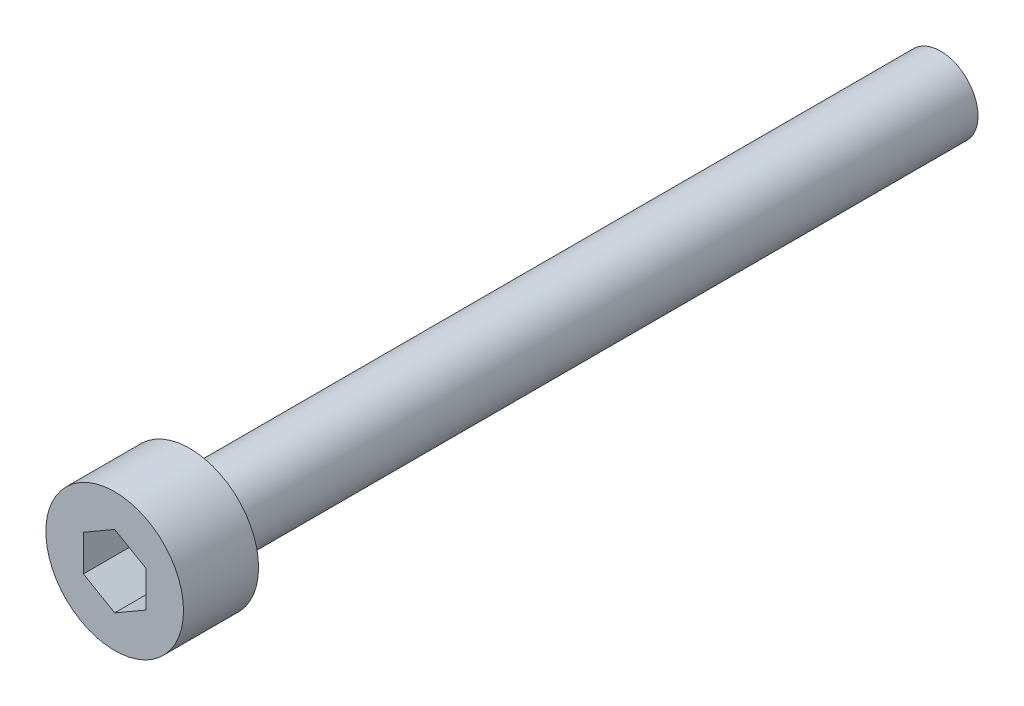
ISO-10303-21;
HEADER;
FILE_DESCRIPTION(('STEP AP214'),'2;1');
FILE_NAME('part.step','',(''),(''),'','','');
FILE_SCHEMA(('AUTOMOTIVE_DESIGN { 1 0 10303 214 1 1 1 1 }'));
ENDSEC;
DATA;
#1=APPLICATION_CONTEXT('core data for automotive mechanical design processes');
#2=APPLICATION_PROTOCOL_DEFINITION('international standard','automotive_design',2000,#1);
#3=PRODUCT_CONTEXT('',#1,'mechanical');
#4=PRODUCT('Part','Part','',(#3));
#5=PRODUCT_RELATED_PRODUCT_CATEGORY('part','',(#4));
#6=PRODUCT_DEFINITION_FORMATION('','',#4);
#7=PRODUCT_DEFINITION_CONTEXT('part definition',#1,'design');
#8=PRODUCT_DEFINITION('design','',#6,#7);
#9=PRODUCT_DEFINITION_SHAPE('','',#8);
#10=(LENGTH_UNIT() NAMED_UNIT(*) SI_UNIT(.MILLI.,.METRE.));
#11=(NAMED_UNIT(*) PLANE_ANGLE_UNIT() SI_UNIT($,.RADIAN.));
#12=(NAMED_UNIT(*) SI_UNIT($,.STERADIAN.) SOLID_ANGLE_UNIT());
#13=UNCERTAINTY_MEASURE_WITH_UNIT(LENGTH_MEASURE(1.E-05),#10,'distance_accuracy_value','');
#14=(GEOMETRIC_REPRESENTATION_CONTEXT(3) GLOBAL_UNCERTAINTY_ASSIGNED_CONTEXT((#13)) GLOBAL_UNIT_ASSIGNED_CONTEXT((#10,
#11,#12)) REPRESENTATION_CONTEXT('',''));
#15=CARTESIAN_POINT('',(0.,0.,0.));
#16=DIRECTION('',(0.,0.,1.));
#17=DIRECTION('',(1.,0.,0.));
#18=AXIS2_PLACEMENT_3D('',#15,#16,#17);
#19=CARTESIAN_POINT('',(0.,0.,0.));
#20=DIRECTION('',(0.,0.,-1.));
#21=DIRECTION('',(-1.,0.,0.));
#22=AXIS2_PLACEMENT_3D('',#19,#20,#21);
#23=CYLINDRICAL_SURFACE('',#22,1.5);
#24=CARTESIAN_POINT('',(0.,0.,0.));
#25=DIRECTION('',(0.,0.,1.));
#26=DIRECTION('',(1.,0.,0.));
#27=AXIS2_PLACEMENT_3D('',#24,#25,#26);
#28=CIRCLE('',#27,1.5);
#29=CARTESIAN_POINT('',(1.5,0.,0.));
#30=VERTEX_POINT('',#29);
#31=EDGE_CURVE('E11',#30,#30,#28,.T.);
#32=ORIENTED_EDGE('',*,*,#31,.F.);
#33=EDGE_LOOP('',(#32));
#34=FACE_BOUND('',#33,.T.);
#35=CARTESIAN_POINT('',(0.,0.,-30.));
#36=DIRECTION('',(0.,0.,1.));
#37=DIRECTION('',(1.,0.,0.));
#38=AXIS2_PLACEMENT_3D('',#35,#36,#37);
#39=CIRCLE('',#38,1.5);
#40=CARTESIAN_POINT('',(1.5,0.,-30.));
#41=VERTEX_POINT('',#40);
#42=EDGE_CURVE('E46',#41,#41,#39,.T.);
#43=ORIENTED_EDGE('',*,*,#42,.T.);
#44=EDGE_LOOP('',(#43));
#45=FACE_BOUND('',#44,.T.);
#46=ADVANCED_FACE('F43',(#34,#45),#23,.T.);
#47=CARTESIAN_POINT('',(0.,0.,-30.));
#48=DIRECTION('',(0.,0.,1.));
#49=DIRECTION('',(1.,0.,0.));
#50=AXIS2_PLACEMENT_3D('',#47,#48,#49);
#51=PLANE('',#50);
#52=ORIENTED_EDGE('',*,*,#42,.F.);
#53=EDGE_LOOP('',(#52));
#54=FACE_BOUND('',#53,.T.);
#55=ADVANCED_FACE('F164',(#54),#51,.F.);
#56=CARTESIAN_POINT('',(0.,0.,3.));
#57=DIRECTION('',(0.,0.,1.));
#58=DIRECTION('',(1.,0.,0.));
#59=AXIS2_PLACEMENT_3D('',#56,#57,#58);
#60=PLANE('',#59);
#61=CARTESIAN_POINT('',(0.,0.,3.));
#62=DIRECTION('',(0.,0.,1.));
#63=DIRECTION('',(1.,0.,0.));
#64=AXIS2_PLACEMENT_3D('',#61,#62,#63);
#65=CIRCLE('',#64,2.75);
#66=CARTESIAN_POINT('',(2.75,0.,3.));
#67=VERTEX_POINT('',#66);
#68=EDGE_CURVE('E146',#67,#67,#65,.T.);
#69=ORIENTED_EDGE('',*,*,#68,.T.);
#70=EDGE_LOOP('',(#69));
#71=FACE_BOUND('',#70,.T.);
#72=DIRECTION('',(-0.866025403784439,0.5,0.));
#73=VECTOR('',#72,1.);
#74=CARTESIAN_POINT('',(1.25,0.721687836487032,3.));
#75=LINE('',#74,#73);
#76=CARTESIAN_POINT('',(1.25,0.721687836487032,3.));
#77=VERTEX_POINT('',#76);
#78=CARTESIAN_POINT('',(0.,1.44337567297406,3.));
#79=VERTEX_POINT('',#78);
#80=EDGE_CURVE('E103',#77,#79,#75,.T.);
#81=ORIENTED_EDGE('',*,*,#80,.F.);
#82=DIRECTION('',(0.,1.,0.));
#83=VECTOR('',#82,1.);
#84=CARTESIAN_POINT('',(1.25,-0.721687836487033,3.));
#85=LINE('',#84,#83);
#86=CARTESIAN_POINT('',(1.25,-0.721687836487033,3.));
#87=VERTEX_POINT('',#86);
#88=EDGE_CURVE('E94',#87,#77,#85,.T.);
#89=ORIENTED_EDGE('',*,*,#88,.F.);
#90=DIRECTION('',(0.866025403784439,0.5,0.));
#91=VECTOR('',#90,1.);
#92=CARTESIAN_POINT('',(0.,-1.44337567297406,3.));
#93=LINE('',#92,#91);
#94=CARTESIAN_POINT('',(0.,-1.44337567297406,3.));
#95=VERTEX_POINT('',#94);
#96=EDGE_CURVE('E124',#95,#87,#93,.T.);
#97=ORIENTED_EDGE('',*,*,#96,.F.);
#98=DIRECTION('',(0.866025403784439,-0.5,0.));
#99=VECTOR('',#98,1.);
#100=CARTESIAN_POINT('',(-1.25,-0.721687836487032,3.));
#101=LINE('',#100,#99);
#102=CARTESIAN_POINT('',(-1.25,-0.721687836487032,3.));
#103=VERTEX_POINT('',#102);
#104=EDGE_CURVE('E121',#103,#95,#101,.T.);
#105=ORIENTED_EDGE('',*,*,#104,.F.);
#106=DIRECTION('',(0.,-1.,0.));
#107=VECTOR('',#106,1.);
#108=CARTESIAN_POINT('',(-1.25,0.721687836487032,3.));
#109=LINE('',#108,#107);
#110=CARTESIAN_POINT('',(-1.25,0.721687836487032,3.));
#111=VERTEX_POINT('',#110);
#112=EDGE_CURVE('E117',#111,#103,#109,.T.);
#113=ORIENTED_EDGE('',*,*,#112,.F.);
#114=DIRECTION('',(-0.866025403784439,-0.5,0.));
#115=VECTOR('',#114,1.);
#116=CARTESIAN_POINT('',(0.,1.44337567297406,3.));
#117=LINE('',#116,#115);
#118=EDGE_CURVE('E115',#79,#111,#117,.T.);
#119=ORIENTED_EDGE('',*,*,#118,.F.);
#120=EDGE_LOOP('',(#81,#89,#97,#105,#113,#119));
#121=FACE_BOUND('',#120,.T.);
#122=ADVANCED_FACE('F113',(#71,#121),#60,.T.);
#123=CARTESIAN_POINT('',(0.,0.,0.));
#124=DIRECTION('',(0.,0.,1.));
#125=DIRECTION('',(1.,0.,0.));
#126=AXIS2_PLACEMENT_3D('',#123,#124,#125);
#127=PLANE('',#126);
#128=ORIENTED_EDGE('',*,*,#31,.T.);
#129=EDGE_LOOP('',(#128));
#130=FACE_BOUND('',#129,.T.);
#131=CARTESIAN_POINT('',(0.,0.,0.));
#132=DIRECTION('',(0.,0.,1.));
#133=DIRECTION('',(1.,0.,0.));
#134=AXIS2_PLACEMENT_3D('',#131,#132,#133);
#135=CIRCLE('',#134,2.75);
#136=CARTESIAN_POINT('',(2.75,0.,0.));
#137=VERTEX_POINT('',#136);
#138=EDGE_CURVE('E109',#137,#137,#135,.T.);
#139=ORIENTED_EDGE('',*,*,#138,.F.);
#140=EDGE_LOOP('',(#139));
#141=FACE_BOUND('',#140,.T.);
#142=ADVANCED_FACE('F154',(#130,#141),#127,.F.);
#143=CARTESIAN_POINT('',(0.,0.,3.));
#144=DIRECTION('',(0.,0.,-1.));
#145=DIRECTION('',(-1.,0.,0.));
#146=AXIS2_PLACEMENT_3D('',#143,#144,#145);
#147=CYLINDRICAL_SURFACE('',#146,2.75);
#148=ORIENTED_EDGE('',*,*,#68,.F.);
#149=EDGE_LOOP('',(#148));
#150=FACE_BOUND('',#149,.T.);
#151=ORIENTED_EDGE('',*,*,#138,.T.);
#152=EDGE_LOOP('',(#151));
#153=FACE_BOUND('',#152,.T.);
#154=ADVANCED_FACE('F152',(#150,#153),#147,.T.);
#155=CARTESIAN_POINT('',(1.25,-0.721687836487033,3.));
#156=DIRECTION('',(-1.,0.,0.));
#157=DIRECTION('',(0.,-1.,0.));
#158=AXIS2_PLACEMENT_3D('',#155,#156,#157);
#159=PLANE('',#158);
#160=DIRECTION('',(0.,1.,0.));
#161=VECTOR('',#160,1.);
#162=CARTESIAN_POINT('',(1.25,-0.721687836487033,0.));
#163=LINE('',#162,#161);
#164=CARTESIAN_POINT('',(1.25,-0.721687836487033,0.));
#165=VERTEX_POINT('',#164);
#166=CARTESIAN_POINT('',(1.25,0.721687836487032,0.));
#167=VERTEX_POINT('',#166);
#168=EDGE_CURVE('E57',#165,#167,#163,.T.);
#169=ORIENTED_EDGE('',*,*,#168,.F.);
#170=DIRECTION('',(0.,0.,-1.));
#171=VECTOR('',#170,1.);
#172=CARTESIAN_POINT('',(1.25,-0.721687836487033,3.));
#173=LINE('',#172,#171);
#174=EDGE_CURVE('E99',#87,#165,#173,.T.);
#175=ORIENTED_EDGE('',*,*,#174,.F.);
#176=ORIENTED_EDGE('',*,*,#88,.T.);
#177=DIRECTION('',(0.,0.,-1.));
#178=VECTOR('',#177,1.);
#179=CARTESIAN_POINT('',(1.25,0.721687836487032,3.));
#180=LINE('',#179,#178);
#181=EDGE_CURVE('E97',#77,#167,#180,.T.);
#182=ORIENTED_EDGE('',*,*,#181,.T.);
#183=EDGE_LOOP('',(#169,#175,#176,#182));
#184=FACE_BOUND('',#183,.T.);
#185=ADVANCED_FACE('F96',(#184),#159,.T.);
#186=CARTESIAN_POINT('',(1.25,0.721687836487032,3.));
#187=DIRECTION('',(-0.5,-0.866025403784439,0.));
#188=DIRECTION('',(0.866025403784439,-0.5,0.));
#189=AXIS2_PLACEMENT_3D('',#186,#187,#188);
#190=PLANE('',#189);
#191=DIRECTION('',(-0.866025403784439,0.5,0.));
#192=VECTOR('',#191,1.);
#193=CARTESIAN_POINT('',(1.25,0.721687836487032,0.));
#194=LINE('',#193,#192);
#195=CARTESIAN_POINT('',(0.,1.44337567297406,0.));
#196=VERTEX_POINT('',#195);
#197=EDGE_CURVE('E61',#167,#196,#194,.T.);
#198=ORIENTED_EDGE('',*,*,#197,.F.);
#199=ORIENTED_EDGE('',*,*,#181,.F.);
#200=ORIENTED_EDGE('',*,*,#80,.T.);
#201=DIRECTION('',(0.,0.,-1.));
#202=VECTOR('',#201,1.);
#203=CARTESIAN_POINT('',(0.,1.44337567297406,3.));
#204=LINE('',#203,#202);
#205=EDGE_CURVE('E110',#79,#196,#204,.T.);
#206=ORIENTED_EDGE('',*,*,#205,.T.);
#207=EDGE_LOOP('',(#198,#199,#200,#206));
#208=FACE_BOUND('',#207,.T.);
#209=ADVANCED_FACE('F107',(#208),#190,.T.);
#210=CARTESIAN_POINT('',(0.,1.44337567297406,3.));
#211=DIRECTION('',(0.5,-0.866025403784439,0.));
#212=DIRECTION('',(0.866025403784439,0.5,0.));
#213=AXIS2_PLACEMENT_3D('',#210,#211,#212);
#214=PLANE('',#213);
#215=DIRECTION('',(-0.866025403784439,-0.5,0.));
#216=VECTOR('',#215,1.);
#217=CARTESIAN_POINT('',(0.,1.44337567297406,0.));
#218=LINE('',#217,#216);
#219=CARTESIAN_POINT('',(-1.25,0.721687836487032,0.));
#220=VERTEX_POINT('',#219);
#221=EDGE_CURVE('E128',#196,#220,#218,.T.);
#222=ORIENTED_EDGE('',*,*,#221,.F.);
#223=ORIENTED_EDGE('',*,*,#205,.F.);
#224=ORIENTED_EDGE('',*,*,#118,.T.);
#225=DIRECTION('',(0.,0.,-1.));
#226=VECTOR('',#225,1.);
#227=CARTESIAN_POINT('',(-1.25,0.721687836487032,3.));
#228=LINE('',#227,#226);
#229=EDGE_CURVE('E142',#111,#220,#228,.T.);
#230=ORIENTED_EDGE('',*,*,#229,.T.);
#231=EDGE_LOOP('',(#222,#223,#224,#230));
#232=FACE_BOUND('',#231,.T.);
#233=ADVANCED_FACE('F199',(#232),#214,.T.);
#234=CARTESIAN_POINT('',(-1.25,0.721687836487032,3.));
#235=DIRECTION('',(1.,0.,0.));
#236=DIRECTION('',(0.,1.,0.));
#237=AXIS2_PLACEMENT_3D('',#234,#235,#236);
#238=PLANE('',#237);
#239=DIRECTION('',(0.,-1.,0.));
#240=VECTOR('',#239,1.);
#241=CARTESIAN_POINT('',(-1.25,0.721687836487032,0.));
#242=LINE('',#241,#240);
#243=CARTESIAN_POINT('',(-1.25,-0.721687836487033,0.));
#244=VERTEX_POINT('',#243);
#245=EDGE_CURVE('E130',#220,#244,#242,.T.);
#246=ORIENTED_EDGE('',*,*,#245,.F.);
#247=ORIENTED_EDGE('',*,*,#229,.F.);
#248=ORIENTED_EDGE('',*,*,#112,.T.);
#249=DIRECTION('',(0.,0.,-1.));
#250=VECTOR('',#249,1.);
#251=CARTESIAN_POINT('',(-1.25,-0.721687836487032,3.));
#252=LINE('',#251,#250);
#253=EDGE_CURVE('E139',#103,#244,#252,.T.);
#254=ORIENTED_EDGE('',*,*,#253,.T.);
#255=EDGE_LOOP('',(#246,#247,#248,#254));
#256=FACE_BOUND('',#255,.T.);
#257=ADVANCED_FACE('F192',(#256),#238,.T.);
#258=CARTESIAN_POINT('',(-1.25,-0.721687836487032,3.));
#259=DIRECTION('',(0.5,0.866025403784439,0.));
#260=DIRECTION('',(-0.866025403784439,0.5,0.));
#261=AXIS2_PLACEMENT_3D('',#258,#259,#260);
#262=PLANE('',#261);
#263=DIRECTION('',(0.866025403784439,-0.5,0.));
#264=VECTOR('',#263,1.);
#265=CARTESIAN_POINT('',(-1.25,-0.721687836487032,0.));
#266=LINE('',#265,#264);
#267=CARTESIAN_POINT('',(0.,-1.44337567297406,0.));
#268=VERTEX_POINT('',#267);
#269=EDGE_CURVE('E132',#244,#268,#266,.T.);
#270=ORIENTED_EDGE('',*,*,#269,.F.);
#271=ORIENTED_EDGE('',*,*,#253,.F.);
#272=ORIENTED_EDGE('',*,*,#104,.T.);
#273=DIRECTION('',(0.,0.,-1.));
#274=VECTOR('',#273,1.);
#275=CARTESIAN_POINT('',(0.,-1.44337567297406,3.));
#276=LINE('',#275,#274);
#277=EDGE_CURVE('E136',#95,#268,#276,.T.);
#278=ORIENTED_EDGE('',*,*,#277,.T.);
#279=EDGE_LOOP('',(#270,#271,#272,#278));
#280=FACE_BOUND('',#279,.T.);
#281=ADVANCED_FACE('F186',(#280),#262,.T.);
#282=CARTESIAN_POINT('',(0.,-1.44337567297406,3.));
#283=DIRECTION('',(-0.5,0.866025403784439,0.));
#284=DIRECTION('',(-0.866025403784439,-0.5,0.));
#285=AXIS2_PLACEMENT_3D('',#282,#283,#284);
#286=PLANE('',#285);
#287=DIRECTION('',(0.866025403784439,0.5,0.));
#288=VECTOR('',#287,1.);
#289=CARTESIAN_POINT('',(0.,-1.44337567297406,0.));
#290=LINE('',#289,#288);
#291=EDGE_CURVE('E104',#268,#165,#290,.T.);
#292=ORIENTED_EDGE('',*,*,#291,.F.);
#293=ORIENTED_EDGE('',*,*,#277,.F.);
#294=ORIENTED_EDGE('',*,*,#96,.T.);
#295=ORIENTED_EDGE('',*,*,#174,.T.);
#296=EDGE_LOOP('',(#292,#293,#294,#295));
#297=FACE_BOUND('',#296,.T.);
#298=ADVANCED_FACE('F182',(#297),#286,.T.);
#299=CARTESIAN_POINT('',(0.,0.,0.));
#300=DIRECTION('',(0.,0.,1.));
#301=DIRECTION('',(1.,0.,0.));
#302=AXIS2_PLACEMENT_3D('',#299,#300,#301);
#303=PLANE('',#302);
#304=ORIENTED_EDGE('',*,*,#168,.T.);
#305=ORIENTED_EDGE('',*,*,#197,.T.);
#306=ORIENTED_EDGE('',*,*,#221,.T.);
#307=ORIENTED_EDGE('',*,*,#245,.T.);
#308=ORIENTED_EDGE('',*,*,#269,.T.);
#309=ORIENTED_EDGE('',*,*,#291,.T.);
#310=EDGE_LOOP('',(#304,#305,#306,#307,#308,#309));
#311=FACE_BOUND('',#310,.T.);
#312=ADVANCED_FACE('F180',(#311),#303,.T.);
#313=CLOSED_SHELL('',(#46,#55,#122,#142,#154,#185,#209,#233,#257,#281,#298,#312));
#314=MANIFOLD_SOLID_BREP('B2',#313);
#315=ADVANCED_BREP_SHAPE_REPRESENTATION('',(#18,#314),#14);
#316=SHAPE_DEFINITION_REPRESENTATION(#9,#315);
ENDSEC;
END-ISO-10303-21;
